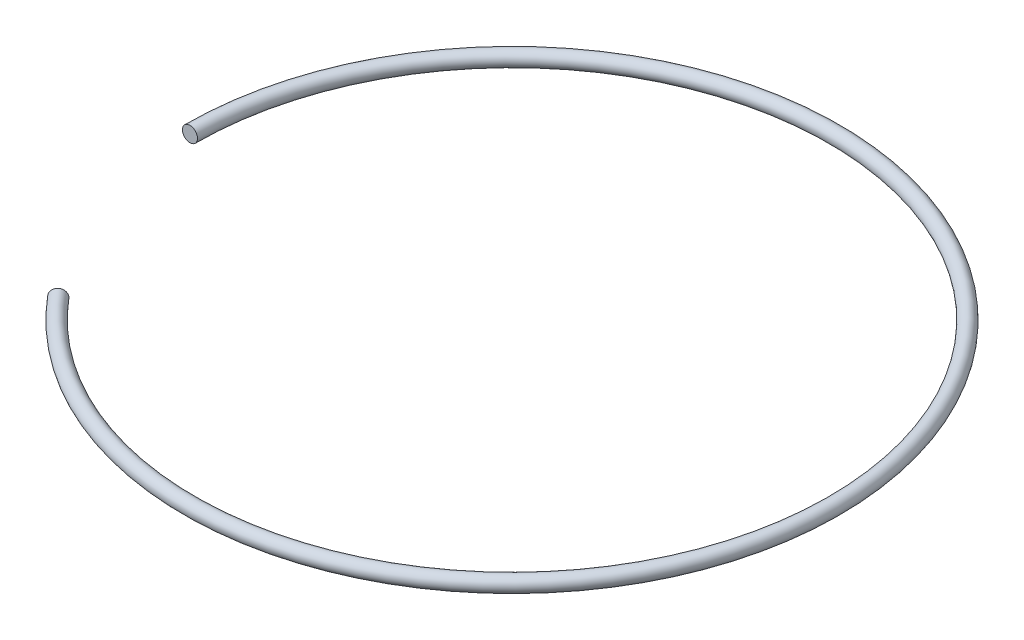
ISO-10303-21;
HEADER;
FILE_DESCRIPTION(('STEP AP214'),'2;1');
FILE_NAME('part.step','',(''),(''),'','','');
FILE_SCHEMA(('AUTOMOTIVE_DESIGN { 1 0 10303 214 1 1 1 1 }'));
ENDSEC;
DATA;
#1=APPLICATION_CONTEXT('core data for automotive mechanical design processes');
#2=APPLICATION_PROTOCOL_DEFINITION('international standard','automotive_design',2000,#1);
#3=PRODUCT_CONTEXT('',#1,'mechanical');
#4=PRODUCT('Part','Part','',(#3));
#5=PRODUCT_RELATED_PRODUCT_CATEGORY('part','',(#4));
#6=PRODUCT_DEFINITION_FORMATION('','',#4);
#7=PRODUCT_DEFINITION_CONTEXT('part definition',#1,'design');
#8=PRODUCT_DEFINITION('design','',#6,#7);
#9=PRODUCT_DEFINITION_SHAPE('','',#8);
#10=(LENGTH_UNIT() NAMED_UNIT(*) SI_UNIT(.MILLI.,.METRE.));
#11=(NAMED_UNIT(*) PLANE_ANGLE_UNIT() SI_UNIT($,.RADIAN.));
#12=(NAMED_UNIT(*) SI_UNIT($,.STERADIAN.) SOLID_ANGLE_UNIT());
#13=UNCERTAINTY_MEASURE_WITH_UNIT(LENGTH_MEASURE(1.E-05),#10,'distance_accuracy_value','');
#14=(GEOMETRIC_REPRESENTATION_CONTEXT(3) GLOBAL_UNCERTAINTY_ASSIGNED_CONTEXT((#13)) GLOBAL_UNIT_ASSIGNED_CONTEXT((#10,
#11,#12)) REPRESENTATION_CONTEXT('',''));
#15=CARTESIAN_POINT('',(0.,0.,0.));
#16=DIRECTION('',(0.,0.,1.));
#17=DIRECTION('',(1.,0.,0.));
#18=AXIS2_PLACEMENT_3D('',#15,#16,#17);
#19=CARTESIAN_POINT('',(0.,5.,0.));
#20=DIRECTION('',(0.,0.,1.));
#21=DIRECTION('',(1.,0.,0.));
#22=AXIS2_PLACEMENT_3D('',#19,#20,#21);
#23=PLANE('',#22);
#24=CARTESIAN_POINT('',(-6.25,0.440000000000001,0.));
#25=CARTESIAN_POINT('',(-6.25001062983499,0.42319249164499,0.));
#26=CARTESIAN_POINT('',(-6.25287538462174,0.406281558710686,0.));
#27=CARTESIAN_POINT('',(-6.26403597751348,0.374416764003044,0.));
#28=CARTESIAN_POINT('',(-6.27233181561848,0.359462902229706,0.));
#29=CARTESIAN_POINT('',(-6.29340700512756,0.333129254032242,0.));
#30=CARTESIAN_POINT('',(-6.30618635653177,0.321749467608205,0.));
#31=CARTESIAN_POINT('',(-6.33479109373737,0.303865334950795,0.));
#32=CARTESIAN_POINT('',(-6.35061647953878,0.297360988717422,0.));
#33=CARTESIAN_POINT('',(-6.38352818642906,0.289956461444852,0.));
#34=CARTESIAN_POINT('',(-6.40061450751794,0.289056280405655,0.));
#35=CARTESIAN_POINT('',(-6.43412206349802,0.292961554634673,0.));
#36=CARTESIAN_POINT('',(-6.45054329838922,0.297767009902889,0.));
#37=CARTESIAN_POINT('',(-6.48086889279606,0.312546438693666,0.));
#38=CARTESIAN_POINT('',(-6.49477325231169,0.322520412216229,0.));
#39=CARTESIAN_POINT('',(-6.51849883134805,0.346493762829983,0.));
#40=CARTESIAN_POINT('',(-6.52832005086878,0.360493139921176,0.));
#41=CARTESIAN_POINT('',(-6.54276711566352,0.391008812850514,0.));
#42=CARTESIAN_POINT('',(-6.54739296093752,0.40752510868866,0.));
#43=CARTESIAN_POINT('',(-6.54972637429642,0.429476017085076,0.));
#44=CARTESIAN_POINT('',(-6.55000333113523,0.434732930161899,0.));
#45=CARTESIAN_POINT('',(-6.54998937016501,0.456807508355013,0.));
#46=CARTESIAN_POINT('',(-6.54712461537826,0.473718441289317,0.));
#47=CARTESIAN_POINT('',(-6.53596402248651,0.505583235996959,0.));
#48=CARTESIAN_POINT('',(-6.52766818438152,0.520537097770296,0.));
#49=CARTESIAN_POINT('',(-6.50659299487244,0.546870745967761,0.));
#50=CARTESIAN_POINT('',(-6.49381364346823,0.558250532391797,0.));
#51=CARTESIAN_POINT('',(-6.46520890626262,0.576134665049207,0.));
#52=CARTESIAN_POINT('',(-6.44938352046122,0.58263901128258,0.));
#53=CARTESIAN_POINT('',(-6.41647181357094,0.590043538555151,0.));
#54=CARTESIAN_POINT('',(-6.39938549248206,0.590943719594348,0.));
#55=CARTESIAN_POINT('',(-6.36587793650198,0.587038445365329,0.));
#56=CARTESIAN_POINT('',(-6.34945670161078,0.582232990097113,0.));
#57=CARTESIAN_POINT('',(-6.31913110720394,0.567453561306335,0.));
#58=CARTESIAN_POINT('',(-6.30522674768831,0.557479587783773,0.));
#59=CARTESIAN_POINT('',(-6.28150116865195,0.533506237170019,0.));
#60=CARTESIAN_POINT('',(-6.27167994913122,0.519506860078827,0.));
#61=CARTESIAN_POINT('',(-6.25723288433648,0.488991187149488,0.));
#62=CARTESIAN_POINT('',(-6.25260703906248,0.472474891311342,0.));
#63=CARTESIAN_POINT('',(-6.25027362570358,0.450523982914926,0.));
#64=CARTESIAN_POINT('',(-6.24999666886477,0.445267069838103,0.));
#65=CARTESIAN_POINT('',(-6.25,0.440000000000001,0.));
#66=B_SPLINE_CURVE_WITH_KNOTS('',3,(#24,#25,#26,#27,#28,#29,#30,#31,#32,#33,#34,#35,#36,#37,#38,
#39,#40,#41,#42,#43,#44,#45,#46,#47,#48,#49,#50,#51,#52,#53,#54,#55,#56,#57,#58,#59,#60,#61,#62,
#63,#64,#65),.UNSPECIFIED.,.T.,.F.,(4,2,2,2,2,2,2,2,2,2,2,2,2,2,2,2,2,2,2,2,4),(0.,
0.0503657057955507,0.100731411591101,0.151097117387923,0.201462823184745,0.251828528981567,
0.302194234778388,0.352559940575211,0.402925646372033,0.453291352168854,0.469074755887429,
0.51944046168298,0.569806167478531,0.620171873275353,0.670537579072175,0.720903284868997,
0.771268990665818,0.82163469646264,0.872000402259461,0.922366108056283,0.938149511774858),.UNSPECIFIED.);
#67=CARTESIAN_POINT('',(-6.25,0.440000000000001,0.));
#68=VERTEX_POINT('',#67);
#69=EDGE_CURVE('E18',#68,#68,#66,.T.);
#70=ORIENTED_EDGE('',*,*,#69,.F.);
#71=EDGE_LOOP('',(#70));
#72=FACE_BOUND('',#71,.T.);
#73=ADVANCED_FACE('F14',(#72),#23,.T.);
#74=CARTESIAN_POINT('',(0.,5.,0.));
#75=DIRECTION('',(0.64278760968653,0.,0.766044443118986));
#76=DIRECTION('',(0.766044443118986,0.,-0.64278760968653));
#77=AXIS2_PLACEMENT_3D('',#74,#75,#76);
#78=PLANE('',#77);
#79=CARTESIAN_POINT('',(-5.01759110242936,0.440000000000001,4.21025884344677));
#80=CARTESIAN_POINT('',(-5.01758295950333,0.42319249164499,4.21025201072055));
#81=CARTESIAN_POINT('',(-5.01538843001804,0.406281558710686,4.20841058183883));
#82=CARTESIAN_POINT('',(-5.00683891985141,0.374416764003044,4.20123669101126));
#83=CARTESIAN_POINT('',(-5.00048393917006,0.359462902229706,4.19590422906541));
#84=CARTESIAN_POINT('',(-4.98433940735895,0.333129254032241,4.18235735837717));
#85=CARTESIAN_POINT('',(-4.97454985622909,0.321749467608205,4.17414294963472));
#86=CARTESIAN_POINT('',(-4.95263735624586,0.303865334950795,4.15575617898062));
#87=CARTESIAN_POINT('',(-4.94051440739248,0.297360988717422,4.14558381706896));
#88=CARTESIAN_POINT('',(-4.91530257721562,0.289956461444852,4.12442857966626));
#89=CARTESIAN_POINT('',(-4.90221369589214,0.289056280405655,4.1134457041752));
#90=CARTESIAN_POINT('',(-4.8765454188311,0.292961554634673,4.09190746236033));
#91=CARTESIAN_POINT('',(-4.86396602309354,0.297767009902889,4.08135209603651));
#92=CARTESIAN_POINT('',(-4.8407352700139,0.312546438693667,4.06185917969542));
#93=CARTESIAN_POINT('',(-4.83008391267182,0.322520412216229,4.05292162967814));
#94=CARTESIAN_POINT('',(-4.81190906469124,0.346493762829984,4.03767112144093));
#95=CARTESIAN_POINT('',(-4.80438557405273,0.360493139921175,4.031358163221));
#96=CARTESIAN_POINT('',(-4.79331848034734,0.391008812850513,4.0220717689746));
#97=CARTESIAN_POINT('',(-4.78977487728046,0.40752510868866,4.01909833294814));
#98=CARTESIAN_POINT('',(-4.78798737894338,0.429476017085077,4.01759844375276));
#99=CARTESIAN_POINT('',(-4.78777521769602,0.434732930161899,4.01742041932836));
#100=CARTESIAN_POINT('',(-4.78778591241968,0.456807508355013,4.01742939326704));
#101=CARTESIAN_POINT('',(-4.78998044190497,0.473718441289317,4.01927082214875));
#102=CARTESIAN_POINT('',(-4.79852995207161,0.505583235996959,4.02644471297632));
#103=CARTESIAN_POINT('',(-4.80488493275296,0.520537097770296,4.03177717492218));
#104=CARTESIAN_POINT('',(-4.82102946456407,0.546870745967761,4.04532404561041));
#105=CARTESIAN_POINT('',(-4.83081901569392,0.558250532391797,4.05353845435286));
#106=CARTESIAN_POINT('',(-4.85273151567716,0.576134665049207,4.07192522500697));
#107=CARTESIAN_POINT('',(-4.86485446453054,0.582639011282581,4.08209758691862));
#108=CARTESIAN_POINT('',(-4.8900662947074,0.590043538555151,4.10325282432133));
#109=CARTESIAN_POINT('',(-4.90315517603088,0.590943719594348,4.11423569981238));
#110=CARTESIAN_POINT('',(-4.92882345309192,0.587038445365329,4.13577394162725));
#111=CARTESIAN_POINT('',(-4.94140284882948,0.582232990097113,4.14632930795107));
#112=CARTESIAN_POINT('',(-4.96463360190912,0.567453561306335,4.16582222429217));
#113=CARTESIAN_POINT('',(-4.9752849592512,0.557479587783773,4.17475977430944));
#114=CARTESIAN_POINT('',(-4.99345980723178,0.53350623717002,4.19001028254665));
#115=CARTESIAN_POINT('',(-5.00098329787029,0.519506860078827,4.19632324076659));
#116=CARTESIAN_POINT('',(-5.01205039157567,0.488991187149489,4.20560963501299));
#117=CARTESIAN_POINT('',(-5.01559399464255,0.472474891311343,4.20858307103945));
#118=CARTESIAN_POINT('',(-5.01738149297964,0.450523982914926,4.21008296023482));
#119=CARTESIAN_POINT('',(-5.01759365422699,0.445267069838103,4.21026098465923));
#120=CARTESIAN_POINT('',(-5.01759110242936,0.440000000000001,4.21025884344677));
#121=B_SPLINE_CURVE_WITH_KNOTS('',3,(#79,#80,#81,#82,#83,#84,#85,#86,#87,#88,#89,#90,#91,#92,
#93,#94,#95,#96,#97,#98,#99,#100,#101,#102,#103,#104,#105,#106,#107,#108,#109,#110,#111,#112,
#113,#114,#115,#116,#117,#118,#119,#120),.UNSPECIFIED.,.T.,.F.,(4,2,2,2,2,2,2,2,2,2,2,2,2,2,2,2,
2,2,2,2,4),(0.,0.0503657057955506,0.100731411591101,0.151097117387924,0.201462823184745,
0.251828528981567,0.302194234778389,0.352559940575211,0.402925646372031,0.453291352168854,
0.469074755887429,0.51944046168298,0.569806167478531,0.620171873275353,0.670537579072175,
0.720903284868996,0.771268990665818,0.821634696462638,0.87200040225946,0.922366108056283,
0.938149511774857),.UNSPECIFIED.);
#122=CARTESIAN_POINT('',(-5.01759110242936,0.440000000000001,4.21025884344677));
#123=VERTEX_POINT('',#122);
#124=EDGE_CURVE('E10',#123,#123,#121,.T.);
#125=ORIENTED_EDGE('',*,*,#124,.F.);
#126=EDGE_LOOP('',(#125));
#127=FACE_BOUND('',#126,.T.);
#128=ADVANCED_FACE('F34',(#127),#78,.F.);
#129=CARTESIAN_POINT('',(0.,0.440000000000001,0.));
#130=DIRECTION('',(0.,-1.,0.));
#131=DIRECTION('',(0.,0.,1.));
#132=AXIS2_PLACEMENT_3D('',#129,#130,#131);
#133=TOROIDAL_SURFACE('',#132,6.4,0.150000000000001);
#134=ORIENTED_EDGE('',*,*,#124,.T.);
#135=EDGE_LOOP('',(#134));
#136=FACE_BOUND('',#135,.T.);
#137=ORIENTED_EDGE('',*,*,#69,.T.);
#138=EDGE_LOOP('',(#137));
#139=FACE_BOUND('',#138,.T.);
#140=ADVANCED_FACE('F36',(#136,#139),#133,.T.);
#141=CLOSED_SHELL('',(#73,#128,#140));
#142=MANIFOLD_SOLID_BREP('B1',#141);
#143=ADVANCED_BREP_SHAPE_REPRESENTATION('',(#18,#142),#14);
#144=SHAPE_DEFINITION_REPRESENTATION(#9,#143);
ENDSEC;
END-ISO-10303-21;
